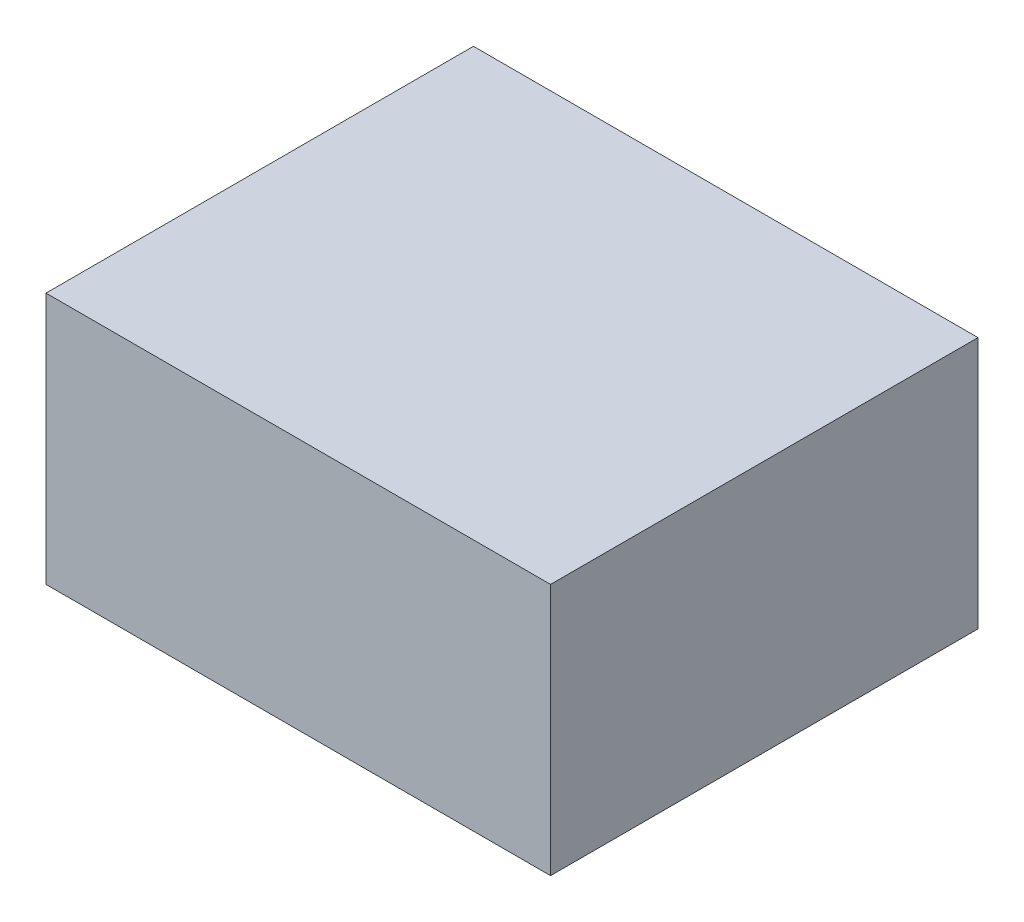
ISO-10303-21;
HEADER;
FILE_DESCRIPTION(('STEP AP214'),'2;1');
FILE_NAME('part.step','',(''),(''),'','','');
FILE_SCHEMA(('AUTOMOTIVE_DESIGN { 1 0 10303 214 1 1 1 1 }'));
ENDSEC;
DATA;
#1=APPLICATION_CONTEXT('core data for automotive mechanical design processes');
#2=APPLICATION_PROTOCOL_DEFINITION('international standard','automotive_design',2000,#1);
#3=PRODUCT_CONTEXT('',#1,'mechanical');
#4=PRODUCT('Part','Part','',(#3));
#5=PRODUCT_RELATED_PRODUCT_CATEGORY('part','',(#4));
#6=PRODUCT_DEFINITION_FORMATION('','',#4);
#7=PRODUCT_DEFINITION_CONTEXT('part definition',#1,'design');
#8=PRODUCT_DEFINITION('design','',#6,#7);
#9=PRODUCT_DEFINITION_SHAPE('','',#8);
#10=(LENGTH_UNIT() NAMED_UNIT(*) SI_UNIT(.MILLI.,.METRE.));
#11=(NAMED_UNIT(*) PLANE_ANGLE_UNIT() SI_UNIT($,.RADIAN.));
#12=(NAMED_UNIT(*) SI_UNIT($,.STERADIAN.) SOLID_ANGLE_UNIT());
#13=UNCERTAINTY_MEASURE_WITH_UNIT(LENGTH_MEASURE(1.E-05),#10,'distance_accuracy_value','');
#14=(GEOMETRIC_REPRESENTATION_CONTEXT(3) GLOBAL_UNCERTAINTY_ASSIGNED_CONTEXT((#13)) GLOBAL_UNIT_ASSIGNED_CONTEXT((#10,
#11,#12)) REPRESENTATION_CONTEXT('',''));
#15=CARTESIAN_POINT('',(0.,0.,0.));
#16=DIRECTION('',(0.,0.,1.));
#17=DIRECTION('',(1.,0.,0.));
#18=AXIS2_PLACEMENT_3D('',#15,#16,#17);
#19=CARTESIAN_POINT('',(0.,0.,12.7));
#20=DIRECTION('',(1.,0.,0.));
#21=DIRECTION('',(0.,0.,-1.));
#22=AXIS2_PLACEMENT_3D('',#19,#20,#21);
#23=PLANE('',#22);
#24=DIRECTION('',(0.,-1.,0.));
#25=VECTOR('',#24,1.);
#26=CARTESIAN_POINT('',(0.,0.,0.));
#27=LINE('',#26,#25);
#28=CARTESIAN_POINT('',(0.,7.49525503239061,0.));
#29=VERTEX_POINT('',#28);
#30=CARTESIAN_POINT('',(0.,0.,0.));
#31=VERTEX_POINT('',#30);
#32=EDGE_CURVE('E96',#29,#31,#27,.T.);
#33=ORIENTED_EDGE('',*,*,#32,.T.);
#34=DIRECTION('',(0.,0.,-1.));
#35=VECTOR('',#34,1.);
#36=CARTESIAN_POINT('',(0.,0.,12.7));
#37=LINE('',#36,#35);
#38=CARTESIAN_POINT('',(0.,0.,12.7));
#39=VERTEX_POINT('',#38);
#40=EDGE_CURVE('E11',#39,#31,#37,.T.);
#41=ORIENTED_EDGE('',*,*,#40,.F.);
#42=DIRECTION('',(0.,-1.,0.));
#43=VECTOR('',#42,1.);
#44=CARTESIAN_POINT('',(0.,0.,12.7));
#45=LINE('',#44,#43);
#46=CARTESIAN_POINT('',(0.,7.49525503239061,12.7));
#47=VERTEX_POINT('',#46);
#48=EDGE_CURVE('E84',#47,#39,#45,.T.);
#49=ORIENTED_EDGE('',*,*,#48,.F.);
#50=DIRECTION('',(0.,0.,-1.));
#51=VECTOR('',#50,1.);
#52=CARTESIAN_POINT('',(0.,7.49525503239061,12.7));
#53=LINE('',#52,#51);
#54=EDGE_CURVE('E92',#47,#29,#53,.T.);
#55=ORIENTED_EDGE('',*,*,#54,.T.);
#56=EDGE_LOOP('',(#33,#41,#49,#55));
#57=FACE_BOUND('',#56,.T.);
#58=ADVANCED_FACE('F33',(#57),#23,.F.);
#59=CARTESIAN_POINT('',(0.,0.,12.7));
#60=DIRECTION('',(0.,1.,0.));
#61=DIRECTION('',(0.,0.,1.));
#62=AXIS2_PLACEMENT_3D('',#59,#60,#61);
#63=PLANE('',#62);
#64=DIRECTION('',(1.,0.,0.));
#65=VECTOR('',#64,1.);
#66=CARTESIAN_POINT('',(0.,0.,0.));
#67=LINE('',#66,#65);
#68=CARTESIAN_POINT('',(14.9905100647812,0.,0.));
#69=VERTEX_POINT('',#68);
#70=EDGE_CURVE('E88',#31,#69,#67,.T.);
#71=ORIENTED_EDGE('',*,*,#70,.T.);
#72=DIRECTION('',(0.,0.,-1.));
#73=VECTOR('',#72,1.);
#74=CARTESIAN_POINT('',(14.9905100647812,0.,12.7));
#75=LINE('',#74,#73);
#76=CARTESIAN_POINT('',(14.9905100647812,0.,12.7));
#77=VERTEX_POINT('',#76);
#78=EDGE_CURVE('E41',#77,#69,#75,.T.);
#79=ORIENTED_EDGE('',*,*,#78,.F.);
#80=DIRECTION('',(1.,0.,0.));
#81=VECTOR('',#80,1.);
#82=CARTESIAN_POINT('',(0.,0.,12.7));
#83=LINE('',#82,#81);
#84=EDGE_CURVE('E79',#39,#77,#83,.T.);
#85=ORIENTED_EDGE('',*,*,#84,.F.);
#86=ORIENTED_EDGE('',*,*,#40,.T.);
#87=EDGE_LOOP('',(#71,#79,#85,#86));
#88=FACE_BOUND('',#87,.T.);
#89=ADVANCED_FACE('F87',(#88),#63,.F.);
#90=CARTESIAN_POINT('',(14.9905100647812,0.,12.7));
#91=DIRECTION('',(-1.,0.,0.));
#92=DIRECTION('',(0.,0.,1.));
#93=AXIS2_PLACEMENT_3D('',#90,#91,#92);
#94=PLANE('',#93);
#95=DIRECTION('',(0.,1.,0.));
#96=VECTOR('',#95,1.);
#97=CARTESIAN_POINT('',(14.9905100647812,0.,0.));
#98=LINE('',#97,#96);
#99=CARTESIAN_POINT('',(14.9905100647812,7.49525503239061,0.));
#100=VERTEX_POINT('',#99);
#101=EDGE_CURVE('E66',#69,#100,#98,.T.);
#102=ORIENTED_EDGE('',*,*,#101,.T.);
#103=DIRECTION('',(0.,0.,-1.));
#104=VECTOR('',#103,1.);
#105=CARTESIAN_POINT('',(14.9905100647812,7.49525503239061,12.7));
#106=LINE('',#105,#104);
#107=CARTESIAN_POINT('',(14.9905100647812,7.49525503239061,12.7));
#108=VERTEX_POINT('',#107);
#109=EDGE_CURVE('E89',#108,#100,#106,.T.);
#110=ORIENTED_EDGE('',*,*,#109,.F.);
#111=DIRECTION('',(0.,1.,0.));
#112=VECTOR('',#111,1.);
#113=CARTESIAN_POINT('',(14.9905100647812,0.,12.7));
#114=LINE('',#113,#112);
#115=EDGE_CURVE('E82',#77,#108,#114,.T.);
#116=ORIENTED_EDGE('',*,*,#115,.F.);
#117=ORIENTED_EDGE('',*,*,#78,.T.);
#118=EDGE_LOOP('',(#102,#110,#116,#117));
#119=FACE_BOUND('',#118,.T.);
#120=ADVANCED_FACE('F90',(#119),#94,.F.);
#121=CARTESIAN_POINT('',(0.,7.49525503239061,12.7));
#122=DIRECTION('',(0.,-1.,0.));
#123=DIRECTION('',(0.,0.,-1.));
#124=AXIS2_PLACEMENT_3D('',#121,#122,#123);
#125=PLANE('',#124);
#126=DIRECTION('',(-1.,0.,0.));
#127=VECTOR('',#126,1.);
#128=CARTESIAN_POINT('',(0.,7.49525503239061,0.));
#129=LINE('',#128,#127);
#130=EDGE_CURVE('E72',#100,#29,#129,.T.);
#131=ORIENTED_EDGE('',*,*,#130,.T.);
#132=ORIENTED_EDGE('',*,*,#54,.F.);
#133=DIRECTION('',(-1.,0.,0.));
#134=VECTOR('',#133,1.);
#135=CARTESIAN_POINT('',(0.,7.49525503239061,12.7));
#136=LINE('',#135,#134);
#137=EDGE_CURVE('E49',#108,#47,#136,.T.);
#138=ORIENTED_EDGE('',*,*,#137,.F.);
#139=ORIENTED_EDGE('',*,*,#109,.T.);
#140=EDGE_LOOP('',(#131,#132,#138,#139));
#141=FACE_BOUND('',#140,.T.);
#142=ADVANCED_FACE('F103',(#141),#125,.F.);
#143=CARTESIAN_POINT('',(0.,0.,12.7));
#144=DIRECTION('',(0.,0.,-1.));
#145=DIRECTION('',(-1.,0.,0.));
#146=AXIS2_PLACEMENT_3D('',#143,#144,#145);
#147=PLANE('',#146);
#148=ORIENTED_EDGE('',*,*,#48,.T.);
#149=ORIENTED_EDGE('',*,*,#84,.T.);
#150=ORIENTED_EDGE('',*,*,#115,.T.);
#151=ORIENTED_EDGE('',*,*,#137,.T.);
#152=EDGE_LOOP('',(#148,#149,#150,#151));
#153=FACE_BOUND('',#152,.T.);
#154=ADVANCED_FACE('F80',(#153),#147,.F.);
#155=CARTESIAN_POINT('',(0.,0.,0.));
#156=DIRECTION('',(0.,0.,-1.));
#157=DIRECTION('',(-1.,0.,0.));
#158=AXIS2_PLACEMENT_3D('',#155,#156,#157);
#159=PLANE('',#158);
#160=ORIENTED_EDGE('',*,*,#32,.F.);
#161=ORIENTED_EDGE('',*,*,#130,.F.);
#162=ORIENTED_EDGE('',*,*,#101,.F.);
#163=ORIENTED_EDGE('',*,*,#70,.F.);
#164=EDGE_LOOP('',(#160,#161,#162,#163));
#165=FACE_BOUND('',#164,.T.);
#166=ADVANCED_FACE('F106',(#165),#159,.T.);
#167=CLOSED_SHELL('',(#58,#89,#120,#142,#154,#166));
#168=MANIFOLD_SOLID_BREP('B2',#167);
#169=ADVANCED_BREP_SHAPE_REPRESENTATION('',(#18,#168),#14);
#170=SHAPE_DEFINITION_REPRESENTATION(#9,#169);
ENDSEC;
END-ISO-10303-21;
